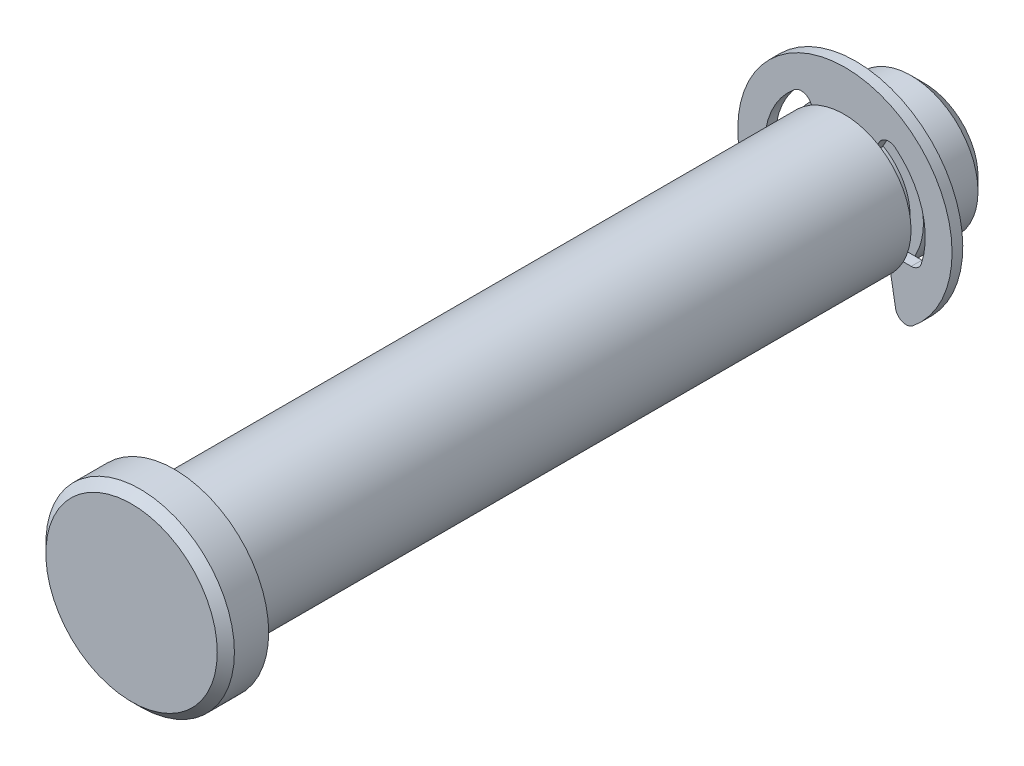
ISO-10303-21;
HEADER;
FILE_DESCRIPTION(('STEP AP214'),'2;1');
FILE_NAME('part.step','',(''),(''),'','','');
FILE_SCHEMA(('AUTOMOTIVE_DESIGN { 1 0 10303 214 1 1 1 1 }'));
ENDSEC;
DATA;
#1=APPLICATION_CONTEXT('core data for automotive mechanical design processes');
#2=APPLICATION_PROTOCOL_DEFINITION('international standard','automotive_design',2000,#1);
#3=PRODUCT_CONTEXT('',#1,'mechanical');
#4=PRODUCT('Part','Part','',(#3));
#5=PRODUCT_RELATED_PRODUCT_CATEGORY('part','',(#4));
#6=PRODUCT_DEFINITION_FORMATION('','',#4);
#7=PRODUCT_DEFINITION_CONTEXT('part definition',#1,'design');
#8=PRODUCT_DEFINITION('design','',#6,#7);
#9=PRODUCT_DEFINITION_SHAPE('','',#8);
#10=(LENGTH_UNIT() NAMED_UNIT(*) SI_UNIT(.MILLI.,.METRE.));
#11=(NAMED_UNIT(*) PLANE_ANGLE_UNIT() SI_UNIT($,.RADIAN.));
#12=(NAMED_UNIT(*) SI_UNIT($,.STERADIAN.) SOLID_ANGLE_UNIT());
#13=UNCERTAINTY_MEASURE_WITH_UNIT(LENGTH_MEASURE(1.E-05),#10,'distance_accuracy_value','');
#14=(GEOMETRIC_REPRESENTATION_CONTEXT(3) GLOBAL_UNCERTAINTY_ASSIGNED_CONTEXT((#13)) GLOBAL_UNIT_ASSIGNED_CONTEXT((#10,
#11,#12)) REPRESENTATION_CONTEXT('',''));
#15=CARTESIAN_POINT('',(0.,0.,0.));
#16=DIRECTION('',(0.,0.,1.));
#17=DIRECTION('',(1.,0.,0.));
#18=AXIS2_PLACEMENT_3D('',#15,#16,#17);
#19=CARTESIAN_POINT('',(0.,0.,-17.5133));
#20=DIRECTION('',(0.,0.,1.));
#21=DIRECTION('',(1.,0.,0.));
#22=AXIS2_PLACEMENT_3D('',#19,#20,#21);
#23=PLANE('',#22);
#24=DIRECTION('',(-0.173648177666931,0.984807753012208,0.));
#25=VECTOR('',#24,1.);
#26=CARTESIAN_POINT('',(2.1376354418804,0.376922803322178,-17.5133));
#27=LINE('',#26,#25);
#28=CARTESIAN_POINT('',(3.00221796143766,-4.52636832140214,-17.5133));
#29=VERTEX_POINT('',#28);
#30=CARTESIAN_POINT('',(2.54,-1.905,-17.5133));
#31=VERTEX_POINT('',#30);
#32=EDGE_CURVE('E199',#29,#31,#27,.T.);
#33=ORIENTED_EDGE('',*,*,#32,.F.);
#34=CARTESIAN_POINT('',(3.62757088460041,-4.41610172858364,-17.5133));
#35=DIRECTION('',(0.,0.,1.));
#36=DIRECTION('',(1.,0.,0.));
#37=AXIS2_PLACEMENT_3D('',#34,#35,#36);
#38=CIRCLE('',#37,0.635);
#39=CARTESIAN_POINT('',(4.03063431622268,-4.90677969842626,-17.5133));
#40=VERTEX_POINT('',#39);
#41=EDGE_CURVE('E253',#29,#40,#38,.T.);
#42=ORIENTED_EDGE('',*,*,#41,.T.);
#43=CARTESIAN_POINT('',(0.,0.,-17.5133));
#44=DIRECTION('',(0.,0.,1.));
#45=DIRECTION('',(1.,0.,0.));
#46=AXIS2_PLACEMENT_3D('',#43,#44,#45);
#47=CIRCLE('',#46,6.35);
#48=CARTESIAN_POINT('',(-4.03063431622268,-4.90677969842626,-17.5133));
#49=VERTEX_POINT('',#48);
#50=EDGE_CURVE('E179',#40,#49,#47,.T.);
#51=ORIENTED_EDGE('',*,*,#50,.T.);
#52=CARTESIAN_POINT('',(-3.62757088460041,-4.41610172858364,-17.5133));
#53=DIRECTION('',(0.,0.,1.));
#54=DIRECTION('',(1.,0.,0.));
#55=AXIS2_PLACEMENT_3D('',#52,#53,#54);
#56=CIRCLE('',#55,0.635);
#57=CARTESIAN_POINT('',(-3.00221796143766,-4.52636832140214,-17.5133));
#58=VERTEX_POINT('',#57);
#59=EDGE_CURVE('E251',#49,#58,#56,.T.);
#60=ORIENTED_EDGE('',*,*,#59,.T.);
#61=DIRECTION('',(-0.173648177666931,-0.984807753012208,0.));
#62=VECTOR('',#61,1.);
#63=CARTESIAN_POINT('',(-2.1376354418804,0.376922803322178,-17.5133));
#64=LINE('',#63,#62);
#65=CARTESIAN_POINT('',(-2.54,-1.905,-17.5133));
#66=VERTEX_POINT('',#65);
#67=EDGE_CURVE('E195',#66,#58,#64,.T.);
#68=ORIENTED_EDGE('',*,*,#67,.F.);
#69=DIRECTION('',(1.,0.,0.));
#70=VECTOR('',#69,1.);
#71=CARTESIAN_POINT('',(0.,-1.905,-17.5133));
#72=LINE('',#71,#70);
#73=CARTESIAN_POINT('',(-3.92725810840082,-1.905,-17.5133));
#74=VERTEX_POINT('',#73);
#75=EDGE_CURVE('E186',#74,#66,#72,.T.);
#76=ORIENTED_EDGE('',*,*,#75,.F.);
#77=CARTESIAN_POINT('',(-3.92725810840082,-1.27,-17.5133));
#78=DIRECTION('',(0.,0.,1.));
#79=DIRECTION('',(1.,0.,0.));
#80=AXIS2_PLACEMENT_3D('',#77,#78,#79);
#81=CIRCLE('',#80,0.635);
#82=CARTESIAN_POINT('',(-4.53145166353941,-1.46538461538462,-17.5133));
#83=VERTEX_POINT('',#82);
#84=EDGE_CURVE('E51',#74,#83,#81,.F.);
#85=ORIENTED_EDGE('',*,*,#84,.T.);
#86=CARTESIAN_POINT('',(0.,0.,-17.5133));
#87=DIRECTION('',(0.,0.,1.));
#88=DIRECTION('',(1.,0.,0.));
#89=AXIS2_PLACEMENT_3D('',#86,#87,#88);
#90=CIRCLE('',#89,4.7625);
#91=CARTESIAN_POINT('',(-2.98743092684563,3.70899753401458,-17.5133));
#92=VERTEX_POINT('',#91);
#93=EDGE_CURVE('E211',#92,#83,#90,.T.);
#94=ORIENTED_EDGE('',*,*,#93,.F.);
#95=CARTESIAN_POINT('',(-2.58910680326621,3.2144645294793,-17.5133));
#96=DIRECTION('',(0.,0.,1.));
#97=DIRECTION('',(1.,0.,0.));
#98=AXIS2_PLACEMENT_3D('',#95,#96,#97);
#99=CIRCLE('',#98,0.635);
#100=CARTESIAN_POINT('',(-2.03918067186309,3.53196452947931,-17.5133));
#101=VERTEX_POINT('',#100);
#102=EDGE_CURVE('E183',#92,#101,#99,.F.);
#103=ORIENTED_EDGE('',*,*,#102,.T.);
#104=DIRECTION('',(-0.500000000000001,0.866025403784438,0.));
#105=VECTOR('',#104,1.);
#106=CARTESIAN_POINT('',(0.,0.,-17.5133));
#107=LINE('',#106,#105);
#108=CARTESIAN_POINT('',(-1.5875,2.74963065701559,-17.5133));
#109=VERTEX_POINT('',#108);
#110=EDGE_CURVE('E175',#109,#101,#107,.T.);
#111=ORIENTED_EDGE('',*,*,#110,.F.);
#112=DIRECTION('',(1.,0.,0.));
#113=VECTOR('',#112,1.);
#114=CARTESIAN_POINT('',(-1.5875,2.74963065701559,-17.5133));
#115=LINE('',#114,#113);
#116=CARTESIAN_POINT('',(1.5875,2.74963065701559,-17.5133));
#117=VERTEX_POINT('',#116);
#118=EDGE_CURVE('E159',#109,#117,#115,.T.);
#119=ORIENTED_EDGE('',*,*,#118,.T.);
#120=DIRECTION('',(-0.500000000000001,-0.866025403784438,0.));
#121=VECTOR('',#120,1.);
#122=CARTESIAN_POINT('',(0.,0.,-17.5133));
#123=LINE('',#122,#121);
#124=CARTESIAN_POINT('',(2.03918067186309,3.53196452947931,-17.5133));
#125=VERTEX_POINT('',#124);
#126=EDGE_CURVE('E209',#125,#117,#123,.T.);
#127=ORIENTED_EDGE('',*,*,#126,.F.);
#128=CARTESIAN_POINT('',(2.58910680326621,3.2144645294793,-17.5133));
#129=DIRECTION('',(0.,0.,1.));
#130=DIRECTION('',(1.,0.,0.));
#131=AXIS2_PLACEMENT_3D('',#128,#129,#130);
#132=CIRCLE('',#131,0.635);
#133=CARTESIAN_POINT('',(2.98743092684563,3.70899753401458,-17.5133));
#134=VERTEX_POINT('',#133);
#135=EDGE_CURVE('E268',#125,#134,#132,.F.);
#136=ORIENTED_EDGE('',*,*,#135,.T.);
#137=CARTESIAN_POINT('',(0.,0.,-17.5133));
#138=DIRECTION('',(0.,0.,1.));
#139=DIRECTION('',(1.,0.,0.));
#140=AXIS2_PLACEMENT_3D('',#137,#138,#139);
#141=CIRCLE('',#140,4.7625);
#142=CARTESIAN_POINT('',(4.53145166353941,-1.46538461538462,-17.5133));
#143=VERTEX_POINT('',#142);
#144=EDGE_CURVE('E214',#143,#134,#141,.T.);
#145=ORIENTED_EDGE('',*,*,#144,.F.);
#146=CARTESIAN_POINT('',(3.92725810840082,-1.27,-17.5133));
#147=DIRECTION('',(0.,0.,1.));
#148=DIRECTION('',(1.,0.,0.));
#149=AXIS2_PLACEMENT_3D('',#146,#147,#148);
#150=CIRCLE('',#149,0.635);
#151=CARTESIAN_POINT('',(3.92725810840082,-1.905,-17.5133));
#152=VERTEX_POINT('',#151);
#153=EDGE_CURVE('E264',#143,#152,#150,.F.);
#154=ORIENTED_EDGE('',*,*,#153,.T.);
#155=DIRECTION('',(1.,0.,0.));
#156=VECTOR('',#155,1.);
#157=CARTESIAN_POINT('',(0.,-1.905,-17.5133));
#158=LINE('',#157,#156);
#159=EDGE_CURVE('E204',#31,#152,#158,.T.);
#160=ORIENTED_EDGE('',*,*,#159,.F.);
#161=EDGE_LOOP('',(#33,#42,#51,#60,#68,#76,#85,#94,#103,#111,#119,#127,#136,#145,#154,#160));
#162=FACE_BOUND('',#161,.T.);
#163=ADVANCED_FACE('F43',(#162),#23,.T.);
#164=CARTESIAN_POINT('',(0.,0.,-18.1483));
#165=DIRECTION('',(0.,0.,1.));
#166=DIRECTION('',(1.,0.,0.));
#167=AXIS2_PLACEMENT_3D('',#164,#165,#166);
#168=PLANE('',#167);
#169=CARTESIAN_POINT('',(0.,0.,-18.1483));
#170=DIRECTION('',(0.,0.,1.));
#171=DIRECTION('',(1.,0.,0.));
#172=AXIS2_PLACEMENT_3D('',#169,#170,#171);
#173=CIRCLE('',#172,6.35);
#174=CARTESIAN_POINT('',(4.03063431622268,-4.90677969842626,-18.1483));
#175=VERTEX_POINT('',#174);
#176=CARTESIAN_POINT('',(-4.03063431622268,-4.90677969842626,-18.1483));
#177=VERTEX_POINT('',#176);
#178=EDGE_CURVE('E217',#175,#177,#173,.T.);
#179=ORIENTED_EDGE('',*,*,#178,.F.);
#180=CARTESIAN_POINT('',(3.62757088460041,-4.41610172858364,-18.1483));
#181=DIRECTION('',(0.,0.,1.));
#182=DIRECTION('',(1.,0.,0.));
#183=AXIS2_PLACEMENT_3D('',#180,#181,#182);
#184=CIRCLE('',#183,0.635);
#185=CARTESIAN_POINT('',(3.00221796143766,-4.52636832140214,-18.1483));
#186=VERTEX_POINT('',#185);
#187=EDGE_CURVE('E261',#175,#186,#184,.F.);
#188=ORIENTED_EDGE('',*,*,#187,.T.);
#189=DIRECTION('',(-0.173648177666931,0.984807753012208,0.));
#190=VECTOR('',#189,1.);
#191=CARTESIAN_POINT('',(2.1376354418804,0.376922803322178,-18.1483));
#192=LINE('',#191,#190);
#193=CARTESIAN_POINT('',(2.54,-1.905,-18.1483));
#194=VERTEX_POINT('',#193);
#195=EDGE_CURVE('E197',#186,#194,#192,.T.);
#196=ORIENTED_EDGE('',*,*,#195,.T.);
#197=DIRECTION('',(1.,0.,0.));
#198=VECTOR('',#197,1.);
#199=CARTESIAN_POINT('',(0.,-1.905,-18.1483));
#200=LINE('',#199,#198);
#201=CARTESIAN_POINT('',(3.92725810840082,-1.905,-18.1483));
#202=VERTEX_POINT('',#201);
#203=EDGE_CURVE('E201',#194,#202,#200,.T.);
#204=ORIENTED_EDGE('',*,*,#203,.T.);
#205=CARTESIAN_POINT('',(3.92725810840082,-1.27,-18.1483));
#206=DIRECTION('',(0.,0.,1.));
#207=DIRECTION('',(1.,0.,0.));
#208=AXIS2_PLACEMENT_3D('',#205,#206,#207);
#209=CIRCLE('',#208,0.635);
#210=CARTESIAN_POINT('',(4.53145166353941,-1.46538461538462,-18.1483));
#211=VERTEX_POINT('',#210);
#212=EDGE_CURVE('E266',#202,#211,#209,.T.);
#213=ORIENTED_EDGE('',*,*,#212,.T.);
#214=CARTESIAN_POINT('',(0.,0.,-18.1483));
#215=DIRECTION('',(0.,0.,1.));
#216=DIRECTION('',(1.,0.,0.));
#217=AXIS2_PLACEMENT_3D('',#214,#215,#216);
#218=CIRCLE('',#217,4.7625);
#219=CARTESIAN_POINT('',(2.98743092684563,3.70899753401458,-18.1483));
#220=VERTEX_POINT('',#219);
#221=EDGE_CURVE('E225',#211,#220,#218,.T.);
#222=ORIENTED_EDGE('',*,*,#221,.T.);
#223=CARTESIAN_POINT('',(2.58910680326621,3.2144645294793,-18.1483));
#224=DIRECTION('',(0.,0.,1.));
#225=DIRECTION('',(1.,0.,0.));
#226=AXIS2_PLACEMENT_3D('',#223,#224,#225);
#227=CIRCLE('',#226,0.635);
#228=CARTESIAN_POINT('',(2.03918067186309,3.53196452947931,-18.1483));
#229=VERTEX_POINT('',#228);
#230=EDGE_CURVE('E270',#220,#229,#227,.T.);
#231=ORIENTED_EDGE('',*,*,#230,.T.);
#232=DIRECTION('',(-0.500000000000001,-0.866025403784438,0.));
#233=VECTOR('',#232,1.);
#234=CARTESIAN_POINT('',(0.,0.,-18.1483));
#235=LINE('',#234,#233);
#236=CARTESIAN_POINT('',(1.5875,2.74963065701559,-18.1483));
#237=VERTEX_POINT('',#236);
#238=EDGE_CURVE('E207',#229,#237,#235,.T.);
#239=ORIENTED_EDGE('',*,*,#238,.T.);
#240=DIRECTION('',(-1.,0.,0.));
#241=VECTOR('',#240,1.);
#242=CARTESIAN_POINT('',(-1.5875,2.74963065701559,-18.1483));
#243=LINE('',#242,#241);
#244=CARTESIAN_POINT('',(-1.5875,2.74963065701559,-18.1483));
#245=VERTEX_POINT('',#244);
#246=EDGE_CURVE('E170',#237,#245,#243,.T.);
#247=ORIENTED_EDGE('',*,*,#246,.T.);
#248=DIRECTION('',(-0.500000000000001,0.866025403784438,0.));
#249=VECTOR('',#248,1.);
#250=CARTESIAN_POINT('',(0.,0.,-18.1483));
#251=LINE('',#250,#249);
#252=CARTESIAN_POINT('',(-2.03918067186309,3.53196452947931,-18.1483));
#253=VERTEX_POINT('',#252);
#254=EDGE_CURVE('E178',#245,#253,#251,.T.);
#255=ORIENTED_EDGE('',*,*,#254,.T.);
#256=CARTESIAN_POINT('',(-2.58910680326621,3.2144645294793,-18.1483));
#257=DIRECTION('',(0.,0.,1.));
#258=DIRECTION('',(1.,0.,0.));
#259=AXIS2_PLACEMENT_3D('',#256,#257,#258);
#260=CIRCLE('',#259,0.635);
#261=CARTESIAN_POINT('',(-2.98743092684563,3.70899753401458,-18.1483));
#262=VERTEX_POINT('',#261);
#263=EDGE_CURVE('E273',#253,#262,#260,.T.);
#264=ORIENTED_EDGE('',*,*,#263,.T.);
#265=CARTESIAN_POINT('',(0.,0.,-18.1483));
#266=DIRECTION('',(0.,0.,1.));
#267=DIRECTION('',(1.,0.,0.));
#268=AXIS2_PLACEMENT_3D('',#265,#266,#267);
#269=CIRCLE('',#268,4.7625);
#270=CARTESIAN_POINT('',(-4.53145166353941,-1.46538461538462,-18.1483));
#271=VERTEX_POINT('',#270);
#272=EDGE_CURVE('E222',#262,#271,#269,.T.);
#273=ORIENTED_EDGE('',*,*,#272,.T.);
#274=CARTESIAN_POINT('',(-3.92725810840082,-1.27,-18.1483));
#275=DIRECTION('',(0.,0.,1.));
#276=DIRECTION('',(1.,0.,0.));
#277=AXIS2_PLACEMENT_3D('',#274,#275,#276);
#278=CIRCLE('',#277,0.635);
#279=CARTESIAN_POINT('',(-3.92725810840082,-1.905,-18.1483));
#280=VERTEX_POINT('',#279);
#281=EDGE_CURVE('E12',#271,#280,#278,.T.);
#282=ORIENTED_EDGE('',*,*,#281,.T.);
#283=DIRECTION('',(1.,0.,0.));
#284=VECTOR('',#283,1.);
#285=CARTESIAN_POINT('',(0.,-1.905,-18.1483));
#286=LINE('',#285,#284);
#287=CARTESIAN_POINT('',(-2.54,-1.905,-18.1483));
#288=VERTEX_POINT('',#287);
#289=EDGE_CURVE('E184',#280,#288,#286,.T.);
#290=ORIENTED_EDGE('',*,*,#289,.T.);
#291=DIRECTION('',(-0.173648177666931,-0.984807753012208,0.));
#292=VECTOR('',#291,1.);
#293=CARTESIAN_POINT('',(-2.1376354418804,0.376922803322178,-18.1483));
#294=LINE('',#293,#292);
#295=CARTESIAN_POINT('',(-3.00221796143766,-4.52636832140214,-18.1483));
#296=VERTEX_POINT('',#295);
#297=EDGE_CURVE('E193',#288,#296,#294,.T.);
#298=ORIENTED_EDGE('',*,*,#297,.T.);
#299=CARTESIAN_POINT('',(-3.62757088460041,-4.41610172858364,-18.1483));
#300=DIRECTION('',(0.,0.,1.));
#301=DIRECTION('',(1.,0.,0.));
#302=AXIS2_PLACEMENT_3D('',#299,#300,#301);
#303=CIRCLE('',#302,0.635);
#304=EDGE_CURVE('E65',#296,#177,#303,.F.);
#305=ORIENTED_EDGE('',*,*,#304,.T.);
#306=EDGE_LOOP('',(#179,#188,#196,#204,#213,#222,#231,#239,#247,#255,#264,#273,#282,#290,#298,#305));
#307=FACE_BOUND('',#306,.T.);
#308=ADVANCED_FACE('F286',(#307),#168,.F.);
#309=CARTESIAN_POINT('',(0.,0.,-17.5133));
#310=DIRECTION('',(0.,0.,-1.));
#311=DIRECTION('',(-1.,0.,0.));
#312=AXIS2_PLACEMENT_3D('',#309,#310,#311);
#313=CYLINDRICAL_SURFACE('',#312,6.35);
#314=ORIENTED_EDGE('',*,*,#50,.F.);
#315=DIRECTION('',(0.,0.,-1.));
#316=VECTOR('',#315,1.);
#317=CARTESIAN_POINT('',(4.03063431622268,-4.90677969842627,-17.5133));
#318=LINE('',#317,#316);
#319=EDGE_CURVE('E258',#40,#175,#318,.T.);
#320=ORIENTED_EDGE('',*,*,#319,.T.);
#321=ORIENTED_EDGE('',*,*,#178,.T.);
#322=DIRECTION('',(0.,0.,-1.));
#323=VECTOR('',#322,1.);
#324=CARTESIAN_POINT('',(-4.03063431622268,-4.90677969842627,-17.5133));
#325=LINE('',#324,#323);
#326=EDGE_CURVE('E255',#177,#49,#325,.F.);
#327=ORIENTED_EDGE('',*,*,#326,.T.);
#328=EDGE_LOOP('',(#314,#320,#321,#327));
#329=FACE_BOUND('',#328,.T.);
#330=ADVANCED_FACE('F326',(#329),#313,.T.);
#331=CARTESIAN_POINT('',(-2.54,-1.905,-22.225));
#332=DIRECTION('',(-0.984807753012208,0.173648177666931,0.));
#333=DIRECTION('',(-0.173648177666931,-0.984807753012208,0.));
#334=AXIS2_PLACEMENT_3D('',#331,#332,#333);
#335=PLANE('',#334);
#336=ORIENTED_EDGE('',*,*,#67,.T.);
#337=DIRECTION('',(0.,0.,-1.));
#338=VECTOR('',#337,1.);
#339=CARTESIAN_POINT('',(-3.00221796143766,-4.52636832140214,-22.225));
#340=LINE('',#339,#338);
#341=EDGE_CURVE('E58',#58,#296,#340,.T.);
#342=ORIENTED_EDGE('',*,*,#341,.T.);
#343=ORIENTED_EDGE('',*,*,#297,.F.);
#344=DIRECTION('',(0.,0.,1.));
#345=VECTOR('',#344,1.);
#346=CARTESIAN_POINT('',(-2.54,-1.905,-22.225));
#347=LINE('',#346,#345);
#348=EDGE_CURVE('E291',#288,#66,#347,.T.);
#349=ORIENTED_EDGE('',*,*,#348,.T.);
#350=EDGE_LOOP('',(#336,#342,#343,#349));
#351=FACE_BOUND('',#350,.T.);
#352=ADVANCED_FACE('F331',(#351),#335,.F.);
#353=CARTESIAN_POINT('',(-2.38125000000001,4.12444598552338,-22.225));
#354=DIRECTION('',(0.866025403784438,0.500000000000001,0.));
#355=DIRECTION('',(-0.500000000000001,0.866025403784438,0.));
#356=AXIS2_PLACEMENT_3D('',#353,#354,#355);
#357=PLANE('',#356);
#358=ORIENTED_EDGE('',*,*,#110,.T.);
#359=DIRECTION('',(0.,0.,-1.));
#360=VECTOR('',#359,1.);
#361=CARTESIAN_POINT('',(-2.03918067186309,3.53196452947931,-18.1483));
#362=LINE('',#361,#360);
#363=EDGE_CURVE('E243',#101,#253,#362,.T.);
#364=ORIENTED_EDGE('',*,*,#363,.T.);
#365=ORIENTED_EDGE('',*,*,#254,.F.);
#366=DIRECTION('',(0.,0.,-1.));
#367=VECTOR('',#366,1.);
#368=CARTESIAN_POINT('',(-1.5875,2.74963065701559,-17.5133));
#369=LINE('',#368,#367);
#370=EDGE_CURVE('E163',#245,#109,#369,.F.);
#371=ORIENTED_EDGE('',*,*,#370,.T.);
#372=EDGE_LOOP('',(#358,#364,#365,#371));
#373=FACE_BOUND('',#372,.T.);
#374=ADVANCED_FACE('F174',(#373),#357,.F.);
#375=CARTESIAN_POINT('',(0.,0.,-22.225));
#376=DIRECTION('',(0.,0.,1.));
#377=DIRECTION('',(1.,0.,0.));
#378=AXIS2_PLACEMENT_3D('',#375,#376,#377);
#379=CYLINDRICAL_SURFACE('',#378,4.7625);
#380=ORIENTED_EDGE('',*,*,#272,.F.);
#381=DIRECTION('',(0.,0.,1.));
#382=VECTOR('',#381,1.);
#383=CARTESIAN_POINT('',(-2.98743092684563,3.70899753401458,-22.225));
#384=LINE('',#383,#382);
#385=EDGE_CURVE('E240',#262,#92,#384,.T.);
#386=ORIENTED_EDGE('',*,*,#385,.T.);
#387=ORIENTED_EDGE('',*,*,#93,.T.);
#388=DIRECTION('',(0.,0.,1.));
#389=VECTOR('',#388,1.);
#390=CARTESIAN_POINT('',(-4.53145166353941,-1.46538461538462,-22.225));
#391=LINE('',#390,#389);
#392=EDGE_CURVE('E238',#83,#271,#391,.F.);
#393=ORIENTED_EDGE('',*,*,#392,.T.);
#394=EDGE_LOOP('',(#380,#386,#387,#393));
#395=FACE_BOUND('',#394,.T.);
#396=ADVANCED_FACE('F281',(#395),#379,.F.);
#397=CARTESIAN_POINT('',(-4.36490334944544,-1.905,-22.225));
#398=DIRECTION('',(0.,-1.,0.));
#399=DIRECTION('',(0.,0.,-1.));
#400=AXIS2_PLACEMENT_3D('',#397,#398,#399);
#401=PLANE('',#400);
#402=ORIENTED_EDGE('',*,*,#289,.F.);
#403=DIRECTION('',(0.,0.,-1.));
#404=VECTOR('',#403,1.);
#405=CARTESIAN_POINT('',(-3.92725810840082,-1.905,-17.5133));
#406=LINE('',#405,#404);
#407=EDGE_CURVE('E245',#280,#74,#406,.F.);
#408=ORIENTED_EDGE('',*,*,#407,.T.);
#409=ORIENTED_EDGE('',*,*,#75,.T.);
#410=ORIENTED_EDGE('',*,*,#348,.F.);
#411=EDGE_LOOP('',(#402,#408,#409,#410));
#412=FACE_BOUND('',#411,.T.);
#413=ADVANCED_FACE('F289',(#412),#401,.F.);
#414=CARTESIAN_POINT('',(0.,0.,-22.225));
#415=DIRECTION('',(0.,0.,1.));
#416=DIRECTION('',(1.,0.,0.));
#417=AXIS2_PLACEMENT_3D('',#414,#415,#416);
#418=CYLINDRICAL_SURFACE('',#417,4.7625);
#419=ORIENTED_EDGE('',*,*,#221,.F.);
#420=DIRECTION('',(0.,0.,1.));
#421=VECTOR('',#420,1.);
#422=CARTESIAN_POINT('',(4.53145166353941,-1.46538461538462,-22.225));
#423=LINE('',#422,#421);
#424=EDGE_CURVE('E230',#211,#143,#423,.T.);
#425=ORIENTED_EDGE('',*,*,#424,.T.);
#426=ORIENTED_EDGE('',*,*,#144,.T.);
#427=DIRECTION('',(0.,0.,1.));
#428=VECTOR('',#427,1.);
#429=CARTESIAN_POINT('',(2.98743092684563,3.70899753401458,-22.225));
#430=LINE('',#429,#428);
#431=EDGE_CURVE('E228',#134,#220,#430,.F.);
#432=ORIENTED_EDGE('',*,*,#431,.T.);
#433=EDGE_LOOP('',(#419,#425,#426,#432));
#434=FACE_BOUND('',#433,.T.);
#435=ADVANCED_FACE('F305',(#434),#418,.F.);
#436=CARTESIAN_POINT('',(2.54,-1.905,-22.225));
#437=DIRECTION('',(0.,-1.,0.));
#438=DIRECTION('',(0.,0.,-1.));
#439=AXIS2_PLACEMENT_3D('',#436,#437,#438);
#440=PLANE('',#439);
#441=ORIENTED_EDGE('',*,*,#159,.T.);
#442=DIRECTION('',(0.,0.,-1.));
#443=VECTOR('',#442,1.);
#444=CARTESIAN_POINT('',(3.92725810840082,-1.905,-18.1483));
#445=LINE('',#444,#443);
#446=EDGE_CURVE('E233',#152,#202,#445,.T.);
#447=ORIENTED_EDGE('',*,*,#446,.T.);
#448=ORIENTED_EDGE('',*,*,#203,.F.);
#449=DIRECTION('',(0.,0.,1.));
#450=VECTOR('',#449,1.);
#451=CARTESIAN_POINT('',(2.54,-1.905,-22.225));
#452=LINE('',#451,#450);
#453=EDGE_CURVE('E188',#194,#31,#452,.T.);
#454=ORIENTED_EDGE('',*,*,#453,.T.);
#455=EDGE_LOOP('',(#441,#447,#448,#454));
#456=FACE_BOUND('',#455,.T.);
#457=ADVANCED_FACE('F315',(#456),#440,.F.);
#458=CARTESIAN_POINT('',(2.54,-1.905,-22.225));
#459=DIRECTION('',(0.984807753012208,0.173648177666931,0.));
#460=DIRECTION('',(-0.173648177666931,0.984807753012208,0.));
#461=AXIS2_PLACEMENT_3D('',#458,#459,#460);
#462=PLANE('',#461);
#463=ORIENTED_EDGE('',*,*,#195,.F.);
#464=DIRECTION('',(0.,0.,-1.));
#465=VECTOR('',#464,1.);
#466=CARTESIAN_POINT('',(3.00221796143766,-4.52636832140214,-22.225));
#467=LINE('',#466,#465);
#468=EDGE_CURVE('E248',#186,#29,#467,.F.);
#469=ORIENTED_EDGE('',*,*,#468,.T.);
#470=ORIENTED_EDGE('',*,*,#32,.T.);
#471=ORIENTED_EDGE('',*,*,#453,.F.);
#472=EDGE_LOOP('',(#463,#469,#470,#471));
#473=FACE_BOUND('',#472,.T.);
#474=ADVANCED_FACE('F320',(#473),#462,.F.);
#475=CARTESIAN_POINT('',(0.,0.,-22.225));
#476=DIRECTION('',(-0.866025403784438,0.500000000000001,0.));
#477=DIRECTION('',(-0.500000000000001,-0.866025403784438,0.));
#478=AXIS2_PLACEMENT_3D('',#475,#476,#477);
#479=PLANE('',#478);
#480=ORIENTED_EDGE('',*,*,#238,.F.);
#481=DIRECTION('',(0.,0.,-1.));
#482=VECTOR('',#481,1.);
#483=CARTESIAN_POINT('',(2.03918067186309,3.53196452947931,-17.5133));
#484=LINE('',#483,#482);
#485=EDGE_CURVE('E235',#229,#125,#484,.F.);
#486=ORIENTED_EDGE('',*,*,#485,.T.);
#487=ORIENTED_EDGE('',*,*,#126,.T.);
#488=DIRECTION('',(0.,0.,-1.));
#489=VECTOR('',#488,1.);
#490=CARTESIAN_POINT('',(1.5875,2.74963065701559,-17.5133));
#491=LINE('',#490,#489);
#492=EDGE_CURVE('E166',#117,#237,#491,.T.);
#493=ORIENTED_EDGE('',*,*,#492,.T.);
#494=EDGE_LOOP('',(#480,#486,#487,#493));
#495=FACE_BOUND('',#494,.T.);
#496=ADVANCED_FACE('F298',(#495),#479,.F.);
#497=CARTESIAN_POINT('',(-1.5875,2.74963065701559,-21.3516676151749));
#498=DIRECTION('',(0.,-1.,0.));
#499=DIRECTION('',(0.,0.,-1.));
#500=AXIS2_PLACEMENT_3D('',#497,#498,#499);
#501=PLANE('',#500);
#502=ORIENTED_EDGE('',*,*,#246,.F.);
#503=ORIENTED_EDGE('',*,*,#492,.F.);
#504=ORIENTED_EDGE('',*,*,#118,.F.);
#505=ORIENTED_EDGE('',*,*,#370,.F.);
#506=EDGE_LOOP('',(#502,#503,#504,#505));
#507=FACE_BOUND('',#506,.T.);
#508=ADVANCED_FACE('F162',(#507),#501,.T.);
#509=CARTESIAN_POINT('',(3.92725810840082,-1.27,-22.225));
#510=DIRECTION('',(0.,0.,1.));
#511=DIRECTION('',(1.,0.,0.));
#512=AXIS2_PLACEMENT_3D('',#509,#510,#511);
#513=CYLINDRICAL_SURFACE('',#512,0.635);
#514=ORIENTED_EDGE('',*,*,#212,.F.);
#515=ORIENTED_EDGE('',*,*,#446,.F.);
#516=ORIENTED_EDGE('',*,*,#153,.F.);
#517=ORIENTED_EDGE('',*,*,#424,.F.);
#518=EDGE_LOOP('',(#514,#515,#516,#517));
#519=FACE_BOUND('',#518,.T.);
#520=ADVANCED_FACE('F311',(#519),#513,.F.);
#521=CARTESIAN_POINT('',(2.58910680326621,3.2144645294793,-22.225));
#522=DIRECTION('',(0.,0.,1.));
#523=DIRECTION('',(1.,0.,0.));
#524=AXIS2_PLACEMENT_3D('',#521,#522,#523);
#525=CYLINDRICAL_SURFACE('',#524,0.635);
#526=ORIENTED_EDGE('',*,*,#230,.F.);
#527=ORIENTED_EDGE('',*,*,#431,.F.);
#528=ORIENTED_EDGE('',*,*,#135,.F.);
#529=ORIENTED_EDGE('',*,*,#485,.F.);
#530=EDGE_LOOP('',(#526,#527,#528,#529));
#531=FACE_BOUND('',#530,.T.);
#532=ADVANCED_FACE('F308',(#531),#525,.F.);
#533=CARTESIAN_POINT('',(-2.58910680326621,3.2144645294793,-22.225));
#534=DIRECTION('',(0.,0.,1.));
#535=DIRECTION('',(1.,0.,0.));
#536=AXIS2_PLACEMENT_3D('',#533,#534,#535);
#537=CYLINDRICAL_SURFACE('',#536,0.635);
#538=ORIENTED_EDGE('',*,*,#263,.F.);
#539=ORIENTED_EDGE('',*,*,#363,.F.);
#540=ORIENTED_EDGE('',*,*,#102,.F.);
#541=ORIENTED_EDGE('',*,*,#385,.F.);
#542=EDGE_LOOP('',(#538,#539,#540,#541));
#543=FACE_BOUND('',#542,.T.);
#544=ADVANCED_FACE('F354',(#543),#537,.F.);
#545=CARTESIAN_POINT('',(-3.92725810840082,-1.27,-22.225));
#546=DIRECTION('',(0.,0.,1.));
#547=DIRECTION('',(1.,0.,0.));
#548=AXIS2_PLACEMENT_3D('',#545,#546,#547);
#549=CYLINDRICAL_SURFACE('',#548,0.635);
#550=ORIENTED_EDGE('',*,*,#281,.F.);
#551=ORIENTED_EDGE('',*,*,#392,.F.);
#552=ORIENTED_EDGE('',*,*,#84,.F.);
#553=ORIENTED_EDGE('',*,*,#407,.F.);
#554=EDGE_LOOP('',(#550,#551,#552,#553));
#555=FACE_BOUND('',#554,.T.);
#556=ADVANCED_FACE('F284',(#555),#549,.F.);
#557=CARTESIAN_POINT('',(3.62757088460041,-4.41610172858364,-17.5133));
#558=DIRECTION('',(0.,0.,-1.));
#559=DIRECTION('',(-1.,0.,0.));
#560=AXIS2_PLACEMENT_3D('',#557,#558,#559);
#561=CYLINDRICAL_SURFACE('',#560,0.635);
#562=ORIENTED_EDGE('',*,*,#187,.F.);
#563=ORIENTED_EDGE('',*,*,#319,.F.);
#564=ORIENTED_EDGE('',*,*,#41,.F.);
#565=ORIENTED_EDGE('',*,*,#468,.F.);
#566=EDGE_LOOP('',(#562,#563,#564,#565));
#567=FACE_BOUND('',#566,.T.);
#568=ADVANCED_FACE('F329',(#567),#561,.T.);
#569=CARTESIAN_POINT('',(-3.62757088460041,-4.41610172858364,-17.5133));
#570=DIRECTION('',(0.,0.,-1.));
#571=DIRECTION('',(-1.,0.,0.));
#572=AXIS2_PLACEMENT_3D('',#569,#570,#571);
#573=CYLINDRICAL_SURFACE('',#572,0.635);
#574=ORIENTED_EDGE('',*,*,#304,.F.);
#575=ORIENTED_EDGE('',*,*,#341,.F.);
#576=ORIENTED_EDGE('',*,*,#59,.F.);
#577=ORIENTED_EDGE('',*,*,#326,.F.);
#578=EDGE_LOOP('',(#574,#575,#576,#577));
#579=FACE_BOUND('',#578,.T.);
#580=ADVANCED_FACE('F45',(#579),#573,.T.);
#581=CLOSED_SHELL('',(#163,#308,#330,#352,#374,#396,#413,#435,#457,#474,#496,#508,#520,#532,
#544,#556,#568,#580));
#582=MANIFOLD_SOLID_BREP('B2',#581);
#583=CARTESIAN_POINT('',(0.,0.,22.225));
#584=DIRECTION('',(0.,0.,-1.));
#585=DIRECTION('',(-1.,0.,0.));
#586=AXIS2_PLACEMENT_3D('',#583,#584,#585);
#587=CYLINDRICAL_SURFACE('',#586,3.96875);
#588=CARTESIAN_POINT('',(0.,0.,22.225));
#589=DIRECTION('',(0.,0.,1.));
#590=DIRECTION('',(1.,0.,0.));
#591=AXIS2_PLACEMENT_3D('',#588,#589,#590);
#592=CIRCLE('',#591,3.96875);
#593=CARTESIAN_POINT('',(3.96875,0.,22.225));
#594=VERTEX_POINT('',#593);
#595=EDGE_CURVE('E506',#594,#594,#592,.T.);
#596=ORIENTED_EDGE('',*,*,#595,.F.);
#597=EDGE_LOOP('',(#596));
#598=FACE_BOUND('',#597,.T.);
#599=CARTESIAN_POINT('',(0.,0.,-17.4625));
#600=DIRECTION('',(0.,0.,1.));
#601=DIRECTION('',(1.,0.,0.));
#602=AXIS2_PLACEMENT_3D('',#599,#600,#601);
#603=CIRCLE('',#602,3.96875);
#604=CARTESIAN_POINT('',(3.96875,0.,-17.4625));
#605=VERTEX_POINT('',#604);
#606=EDGE_CURVE('E518',#605,#605,#603,.T.);
#607=ORIENTED_EDGE('',*,*,#606,.T.);
#608=EDGE_LOOP('',(#607));
#609=FACE_BOUND('',#608,.T.);
#610=ADVANCED_FACE('F486',(#598,#609),#587,.T.);
#611=CARTESIAN_POINT('',(0.,3.96875,-17.4625));
#612=DIRECTION('',(0.,0.,-1.));
#613=DIRECTION('',(-1.,0.,0.));
#614=AXIS2_PLACEMENT_3D('',#611,#612,#613);
#615=PLANE('',#614);
#616=CARTESIAN_POINT('',(0.,0.,-17.4625));
#617=DIRECTION('',(0.,0.,1.));
#618=DIRECTION('',(1.,0.,0.));
#619=AXIS2_PLACEMENT_3D('',#616,#617,#618);
#620=CIRCLE('',#619,3.175);
#621=CARTESIAN_POINT('',(3.175,0.,-17.4625));
#622=VERTEX_POINT('',#621);
#623=EDGE_CURVE('E509',#622,#622,#620,.T.);
#624=ORIENTED_EDGE('',*,*,#623,.T.);
#625=EDGE_LOOP('',(#624));
#626=FACE_BOUND('',#625,.T.);
#627=ORIENTED_EDGE('',*,*,#606,.F.);
#628=EDGE_LOOP('',(#627));
#629=FACE_BOUND('',#628,.T.);
#630=ADVANCED_FACE('F536',(#626,#629),#615,.T.);
#631=CARTESIAN_POINT('',(0.,0.,22.225));
#632=DIRECTION('',(0.,0.,1.));
#633=DIRECTION('',(1.,0.,0.));
#634=AXIS2_PLACEMENT_3D('',#631,#632,#633);
#635=CYLINDRICAL_SURFACE('',#634,3.175);
#636=CARTESIAN_POINT('',(0.,0.,-18.1991));
#637=DIRECTION('',(0.,0.,1.));
#638=DIRECTION('',(1.,0.,0.));
#639=AXIS2_PLACEMENT_3D('',#636,#637,#638);
#640=CIRCLE('',#639,3.175);
#641=CARTESIAN_POINT('',(3.175,0.,-18.1991));
#642=VERTEX_POINT('',#641);
#643=EDGE_CURVE('E512',#642,#642,#640,.T.);
#644=ORIENTED_EDGE('',*,*,#643,.T.);
#645=EDGE_LOOP('',(#644));
#646=FACE_BOUND('',#645,.T.);
#647=ORIENTED_EDGE('',*,*,#623,.F.);
#648=EDGE_LOOP('',(#647));
#649=FACE_BOUND('',#648,.T.);
#650=ADVANCED_FACE('F541',(#646,#649),#635,.T.);
#651=CARTESIAN_POINT('',(0.,3.96875,-18.1991));
#652=DIRECTION('',(0.,0.,1.));
#653=DIRECTION('',(1.,0.,0.));
#654=AXIS2_PLACEMENT_3D('',#651,#652,#653);
#655=PLANE('',#654);
#656=CARTESIAN_POINT('',(0.,0.,-18.1991));
#657=DIRECTION('',(0.,0.,1.));
#658=DIRECTION('',(1.,0.,0.));
#659=AXIS2_PLACEMENT_3D('',#656,#657,#658);
#660=CIRCLE('',#659,3.96875);
#661=CARTESIAN_POINT('',(3.96875,0.,-18.1991));
#662=VERTEX_POINT('',#661);
#663=EDGE_CURVE('E515',#662,#662,#660,.T.);
#664=ORIENTED_EDGE('',*,*,#663,.T.);
#665=EDGE_LOOP('',(#664));
#666=FACE_BOUND('',#665,.T.);
#667=ORIENTED_EDGE('',*,*,#643,.F.);
#668=EDGE_LOOP('',(#667));
#669=FACE_BOUND('',#668,.T.);
#670=ADVANCED_FACE('F547',(#666,#669),#655,.T.);
#671=CARTESIAN_POINT('',(0.,0.,-22.225));
#672=DIRECTION('',(0.,0.,1.));
#673=DIRECTION('',(1.,0.,0.));
#674=AXIS2_PLACEMENT_3D('',#671,#672,#673);
#675=PLANE('',#674);
#676=CARTESIAN_POINT('',(0.,0.,-22.225));
#677=DIRECTION('',(0.,0.,1.));
#678=DIRECTION('',(1.,0.,0.));
#679=AXIS2_PLACEMENT_3D('',#676,#677,#678);
#680=CIRCLE('',#679,3.175);
#681=CARTESIAN_POINT('',(3.175,0.,-22.225));
#682=VERTEX_POINT('',#681);
#683=EDGE_CURVE('E42',#682,#682,#680,.F.);
#684=ORIENTED_EDGE('',*,*,#683,.T.);
#685=EDGE_LOOP('',(#684));
#686=FACE_BOUND('',#685,.T.);
#687=ADVANCED_FACE('F552',(#686),#675,.F.);
#688=CARTESIAN_POINT('',(0.,0.,-21.43125));
#689=DIRECTION('',(0.,0.,1.));
#690=DIRECTION('',(1.,0.,0.));
#691=AXIS2_PLACEMENT_3D('',#688,#689,#690);
#692=CIRCLE('',#691,3.96875);
#693=CARTESIAN_POINT('',(3.96875,0.,-21.43125));
#694=VERTEX_POINT('',#693);
#695=EDGE_CURVE('E493',#694,#694,#692,.T.);
#696=ORIENTED_EDGE('',*,*,#695,.T.);
#697=EDGE_LOOP('',(#696));
#698=FACE_BOUND('',#697,.T.);
#699=ORIENTED_EDGE('',*,*,#663,.F.);
#700=EDGE_LOOP('',(#699));
#701=FACE_BOUND('',#700,.T.);
#702=ADVANCED_FACE('F530',(#698,#701),#587,.T.);
#703=CARTESIAN_POINT('',(0.,0.,22.225));
#704=DIRECTION('',(0.,0.,1.));
#705=DIRECTION('',(1.,0.,0.));
#706=AXIS2_PLACEMENT_3D('',#703,#704,#705);
#707=PLANE('',#706);
#708=CARTESIAN_POINT('',(0.,0.,22.225));
#709=DIRECTION('',(0.,0.,1.));
#710=DIRECTION('',(1.,0.,0.));
#711=AXIS2_PLACEMENT_3D('',#708,#709,#710);
#712=CIRCLE('',#711,5.588);
#713=CARTESIAN_POINT('',(5.588,0.,22.225));
#714=VERTEX_POINT('',#713);
#715=EDGE_CURVE('E521',#714,#714,#712,.T.);
#716=ORIENTED_EDGE('',*,*,#715,.F.);
#717=EDGE_LOOP('',(#716));
#718=FACE_BOUND('',#717,.T.);
#719=ORIENTED_EDGE('',*,*,#595,.T.);
#720=EDGE_LOOP('',(#719));
#721=FACE_BOUND('',#720,.T.);
#722=ADVANCED_FACE('F527',(#718,#721),#707,.F.);
#723=CARTESIAN_POINT('',(0.,0.,24.765));
#724=DIRECTION('',(0.,0.,-1.));
#725=DIRECTION('',(-1.,0.,0.));
#726=AXIS2_PLACEMENT_3D('',#723,#724,#725);
#727=CYLINDRICAL_SURFACE('',#726,5.588);
#728=CARTESIAN_POINT('',(0.,0.,24.257));
#729=DIRECTION('',(0.,0.,1.));
#730=DIRECTION('',(1.,0.,0.));
#731=AXIS2_PLACEMENT_3D('',#728,#729,#730);
#732=CIRCLE('',#731,5.588);
#733=CARTESIAN_POINT('',(5.588,0.,24.257));
#734=VERTEX_POINT('',#733);
#735=EDGE_CURVE('E497',#734,#734,#732,.F.);
#736=ORIENTED_EDGE('',*,*,#735,.T.);
#737=EDGE_LOOP('',(#736));
#738=FACE_BOUND('',#737,.T.);
#739=ORIENTED_EDGE('',*,*,#715,.T.);
#740=EDGE_LOOP('',(#739));
#741=FACE_BOUND('',#740,.T.);
#742=ADVANCED_FACE('F525',(#738,#741),#727,.T.);
#743=CARTESIAN_POINT('',(0.,0.,24.765));
#744=DIRECTION('',(0.,0.,1.));
#745=DIRECTION('',(1.,0.,0.));
#746=AXIS2_PLACEMENT_3D('',#743,#744,#745);
#747=PLANE('',#746);
#748=CARTESIAN_POINT('',(0.,0.,24.765));
#749=DIRECTION('',(0.,0.,1.));
#750=DIRECTION('',(1.,0.,0.));
#751=AXIS2_PLACEMENT_3D('',#748,#749,#750);
#752=CIRCLE('',#751,5.08000000000001);
#753=CARTESIAN_POINT('',(5.08000000000001,0.,24.765));
#754=VERTEX_POINT('',#753);
#755=EDGE_CURVE('E501',#754,#754,#752,.T.);
#756=ORIENTED_EDGE('',*,*,#755,.T.);
#757=EDGE_LOOP('',(#756));
#758=FACE_BOUND('',#757,.T.);
#759=ADVANCED_FACE('F556',(#758),#747,.T.);
#760=CARTESIAN_POINT('',(0.,0.,24.765));
#761=DIRECTION('',(0.,0.,-1.));
#762=DIRECTION('',(-1.,0.,0.));
#763=AXIS2_PLACEMENT_3D('',#760,#761,#762);
#764=CONICAL_SURFACE('',#763,5.08000000000001,0.785398163397442);
#765=ORIENTED_EDGE('',*,*,#735,.F.);
#766=EDGE_LOOP('',(#765));
#767=FACE_BOUND('',#766,.T.);
#768=ORIENTED_EDGE('',*,*,#755,.F.);
#769=EDGE_LOOP('',(#768));
#770=FACE_BOUND('',#769,.T.);
#771=ADVANCED_FACE('F554',(#767,#770),#764,.T.);
#772=CARTESIAN_POINT('',(0.,0.,-21.43125));
#773=DIRECTION('',(0.,0.,1.));
#774=DIRECTION('',(1.,0.,0.));
#775=AXIS2_PLACEMENT_3D('',#772,#773,#774);
#776=CONICAL_SURFACE('',#775,3.96875,0.785398163397453);
#777=ORIENTED_EDGE('',*,*,#683,.F.);
#778=EDGE_LOOP('',(#777));
#779=FACE_BOUND('',#778,.T.);
#780=ORIENTED_EDGE('',*,*,#695,.F.);
#781=EDGE_LOOP('',(#780));
#782=FACE_BOUND('',#781,.T.);
#783=ADVANCED_FACE('F488',(#779,#782),#776,.T.);
#784=CLOSED_SHELL('',(#610,#630,#650,#670,#687,#702,#722,#742,#759,#771,#783));
#785=MANIFOLD_SOLID_BREP('B6',#784);
#786=ADVANCED_BREP_SHAPE_REPRESENTATION('',(#18,#582,#785),#14);
#787=SHAPE_DEFINITION_REPRESENTATION(#9,#786);
ENDSEC;
END-ISO-10303-21;
